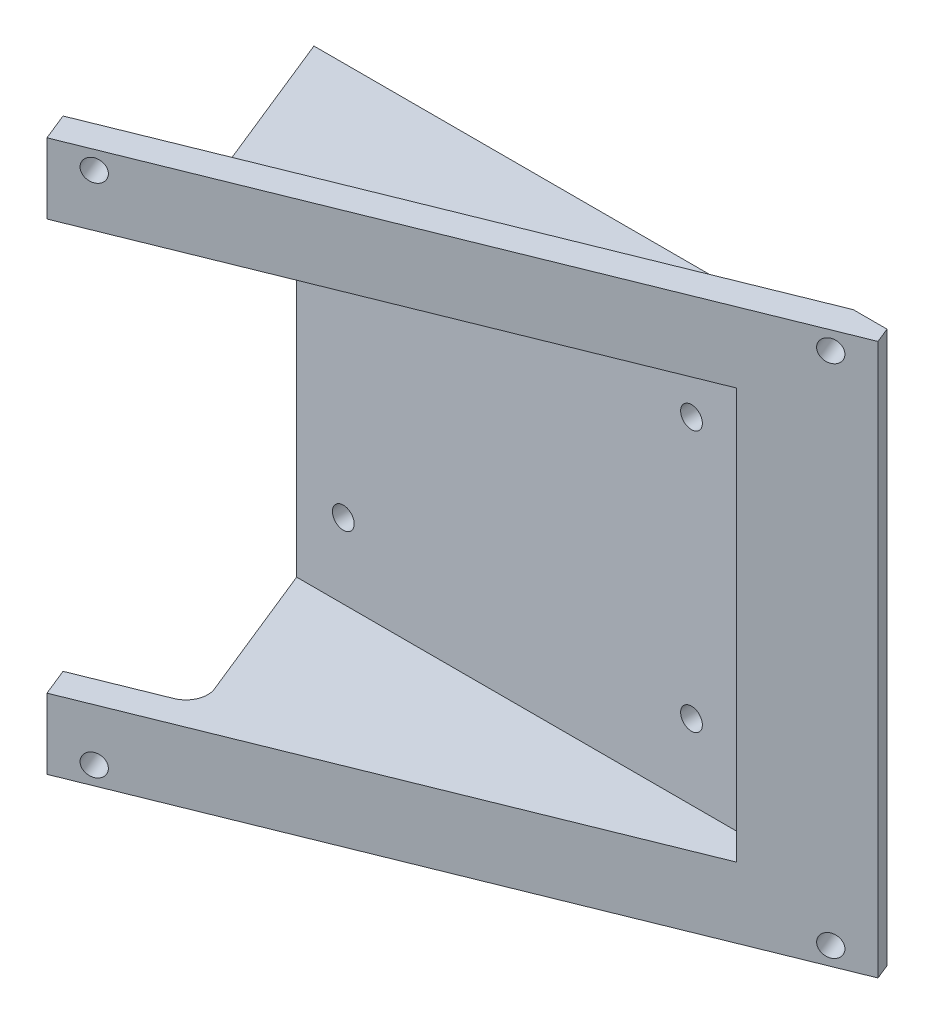
ISO-10303-21;
HEADER;
FILE_DESCRIPTION(('STEP AP214'),'2;1');
FILE_NAME('part.step','',(''),(''),'','','');
FILE_SCHEMA(('AUTOMOTIVE_DESIGN { 1 0 10303 214 1 1 1 1 }'));
ENDSEC;
DATA;
#1=APPLICATION_CONTEXT('core data for automotive mechanical design processes');
#2=APPLICATION_PROTOCOL_DEFINITION('international standard','automotive_design',2000,#1);
#3=PRODUCT_CONTEXT('',#1,'mechanical');
#4=PRODUCT('Part','Part','',(#3));
#5=PRODUCT_RELATED_PRODUCT_CATEGORY('part','',(#4));
#6=PRODUCT_DEFINITION_FORMATION('','',#4);
#7=PRODUCT_DEFINITION_CONTEXT('part definition',#1,'design');
#8=PRODUCT_DEFINITION('design','',#6,#7);
#9=PRODUCT_DEFINITION_SHAPE('','',#8);
#10=(LENGTH_UNIT() NAMED_UNIT(*) SI_UNIT(.MILLI.,.METRE.));
#11=(NAMED_UNIT(*) PLANE_ANGLE_UNIT() SI_UNIT($,.RADIAN.));
#12=(NAMED_UNIT(*) SI_UNIT($,.STERADIAN.) SOLID_ANGLE_UNIT());
#13=UNCERTAINTY_MEASURE_WITH_UNIT(LENGTH_MEASURE(1.E-05),#10,'distance_accuracy_value','');
#14=(GEOMETRIC_REPRESENTATION_CONTEXT(3) GLOBAL_UNCERTAINTY_ASSIGNED_CONTEXT((#13)) GLOBAL_UNIT_ASSIGNED_CONTEXT((#10,
#11,#12)) REPRESENTATION_CONTEXT('',''));
#15=CARTESIAN_POINT('',(0.,0.,0.));
#16=DIRECTION('',(0.,0.,1.));
#17=DIRECTION('',(1.,0.,0.));
#18=AXIS2_PLACEMENT_3D('',#15,#16,#17);
#19=CARTESIAN_POINT('',(5.93580542984478,0.,14.6903458779292));
#20=DIRECTION('',(0.374634830423855,0.,0.927172445574872));
#21=DIRECTION('',(0.927172445574872,0.,-0.374634830423855));
#22=AXIS2_PLACEMENT_3D('',#19,#20,#21);
#23=PLANE('',#22);
#24=CARTESIAN_POINT('',(-30.6567409661375,-35.51699308692,29.4759906404157));
#25=DIRECTION('',(-0.374634830423855,0.,-0.927172445574872));
#26=DIRECTION('',(-0.927172445574872,0.,0.374634830423855));
#27=AXIS2_PLACEMENT_3D('',#24,#25,#26);
#28=CIRCLE('',#27,1.50000000000001);
#29=CARTESIAN_POINT('',(-32.0474996344998,-35.51699308692,30.0379428860515));
#30=VERTEX_POINT('',#29);
#31=EDGE_CURVE('E194',#30,#30,#28,.T.);
#32=ORIENTED_EDGE('',*,*,#31,.F.);
#33=EDGE_LOOP('',(#32));
#34=FACE_BOUND('',#33,.T.);
#35=CARTESIAN_POINT('',(-30.6567409661375,35.48300691308,29.4759906404157));
#36=DIRECTION('',(-0.374634830423855,0.,-0.927172445574872));
#37=DIRECTION('',(-0.927172445574872,0.,0.374634830423855));
#38=AXIS2_PLACEMENT_3D('',#35,#36,#37);
#39=CIRCLE('',#38,1.5);
#40=CARTESIAN_POINT('',(-32.0474996344998,35.48300691308,30.0379428860515));
#41=VERTEX_POINT('',#40);
#42=EDGE_CURVE('E189',#41,#41,#39,.T.);
#43=ORIENTED_EDGE('',*,*,#42,.F.);
#44=EDGE_LOOP('',(#43));
#45=FACE_BOUND('',#44,.T.);
#46=DIRECTION('',(0.,1.,0.));
#47=VECTOR('',#46,1.);
#48=CARTESIAN_POINT('',(42.2924994899524,0.,0.));
#49=LINE('',#48,#47);
#50=CARTESIAN_POINT('',(42.2924994899524,-38.01699308692,0.));
#51=VERTEX_POINT('',#50);
#52=CARTESIAN_POINT('',(42.2924994899524,-36.854381580602,0.));
#53=VERTEX_POINT('',#52);
#54=EDGE_CURVE('E47',#51,#53,#49,.T.);
#55=ORIENTED_EDGE('',*,*,#54,.F.);
#56=DIRECTION('',(0.927172445574872,0.,-0.374634830423855));
#57=VECTOR('',#56,1.);
#58=CARTESIAN_POINT('',(-35.2926031940118,-38.01699308692,31.3491647925349));
#59=LINE('',#58,#57);
#60=CARTESIAN_POINT('',(-35.2926031940118,-38.01699308692,31.3491647925349));
#61=VERTEX_POINT('',#60);
#62=EDGE_CURVE('E252',#61,#51,#59,.T.);
#63=ORIENTED_EDGE('',*,*,#62,.F.);
#64=DIRECTION('',(0.,-1.,0.));
#65=VECTOR('',#64,1.);
#66=CARTESIAN_POINT('',(-35.2926031940118,37.98300691308,31.3491647925349));
#67=LINE('',#66,#65);
#68=CARTESIAN_POINT('',(-35.2926031940118,-28.319785640601,31.349164792535));
#69=VERTEX_POINT('',#68);
#70=EDGE_CURVE('E237',#69,#61,#67,.T.);
#71=ORIENTED_EDGE('',*,*,#70,.F.);
#72=DIRECTION('',(-0.927172445574872,0.,0.374634830423855));
#73=VECTOR('',#72,1.);
#74=CARTESIAN_POINT('',(5.93580542984478,-28.319785640601,14.6903458779292));
#75=LINE('',#74,#73);
#76=CARTESIAN_POINT('',(-24.399681259183,-28.319785640601,26.9477527560236));
#77=VERTEX_POINT('',#76);
#78=EDGE_CURVE('E268',#77,#69,#75,.T.);
#79=ORIENTED_EDGE('',*,*,#78,.F.);
#80=DIRECTION('',(0.,1.,0.));
#81=VECTOR('',#80,1.);
#82=CARTESIAN_POINT('',(-24.399681259183,-32.41699308692,26.9477527560236));
#83=LINE('',#82,#81);
#84=CARTESIAN_POINT('',(-24.399681259183,-35.319785640601,26.9477527560236));
#85=VERTEX_POINT('',#84);
#86=EDGE_CURVE('E594',#77,#85,#83,.F.);
#87=ORIENTED_EDGE('',*,*,#86,.T.);
#88=DIRECTION('',(-0.927172445574872,0.,0.374634830423855));
#89=VECTOR('',#88,1.);
#90=CARTESIAN_POINT('',(32.39302010064,-35.319785640601,4.));
#91=LINE('',#90,#89);
#92=CARTESIAN_POINT('',(36.5639418050511,-35.319785640601,2.31469048406159));
#93=VERTEX_POINT('',#92);
#94=EDGE_CURVE('E574',#85,#93,#91,.F.);
#95=ORIENTED_EDGE('',*,*,#94,.T.);
#96=DIRECTION('',(0.,-1.,0.));
#97=VECTOR('',#96,1.);
#98=CARTESIAN_POINT('',(36.5639418050511,0.,2.31469048406159));
#99=LINE('',#98,#97);
#100=CARTESIAN_POINT('',(36.5639418050511,35.280214359399,2.31469048406159));
#101=VERTEX_POINT('',#100);
#102=EDGE_CURVE('E361',#93,#101,#99,.F.);
#103=ORIENTED_EDGE('',*,*,#102,.T.);
#104=DIRECTION('',(0.927172445574872,0.,-0.374634830423855));
#105=VECTOR('',#104,1.);
#106=CARTESIAN_POINT('',(5.93580542984478,35.280214359399,14.6903458779292));
#107=LINE('',#106,#105);
#108=CARTESIAN_POINT('',(33.5169245919116,35.280214359399,3.54587329411082));
#109=VERTEX_POINT('',#108);
#110=EDGE_CURVE('E368',#101,#109,#107,.F.);
#111=ORIENTED_EDGE('',*,*,#110,.T.);
#112=DIRECTION('',(0.927172445574872,0.,-0.374634830423855));
#113=VECTOR('',#112,1.);
#114=CARTESIAN_POINT('',(32.39302010064,35.28300691308,4.));
#115=LINE('',#114,#113);
#116=CARTESIAN_POINT('',(-24.399681259183,35.28300691308,26.9477527560236));
#117=VERTEX_POINT('',#116);
#118=EDGE_CURVE('E55',#109,#117,#115,.F.);
#119=ORIENTED_EDGE('',*,*,#118,.T.);
#120=DIRECTION('',(0.,1.,0.));
#121=VECTOR('',#120,1.);
#122=CARTESIAN_POINT('',(-24.399681259183,-32.41699308692,26.9477527560236));
#123=LINE('',#122,#121);
#124=CARTESIAN_POINT('',(-24.3996812591829,28.28300691308,26.9477527560236));
#125=VERTEX_POINT('',#124);
#126=EDGE_CURVE('E582',#117,#125,#123,.F.);
#127=ORIENTED_EDGE('',*,*,#126,.T.);
#128=DIRECTION('',(-0.927172445574872,0.,0.374634830423855));
#129=VECTOR('',#128,1.);
#130=CARTESIAN_POINT('',(32.39302010064,28.28300691308,4.));
#131=LINE('',#130,#129);
#132=CARTESIAN_POINT('',(-35.2926031940118,28.28300691308,31.3491647925349));
#133=VERTEX_POINT('',#132);
#134=EDGE_CURVE('E222',#125,#133,#131,.T.);
#135=ORIENTED_EDGE('',*,*,#134,.T.);
#136=CARTESIAN_POINT('',(-35.2926031940118,37.98300691308,31.3491647925349));
#137=VERTEX_POINT('',#136);
#138=EDGE_CURVE('E249',#137,#133,#67,.T.);
#139=ORIENTED_EDGE('',*,*,#138,.F.);
#140=DIRECTION('',(-0.927172445574872,0.,0.374634830423855));
#141=VECTOR('',#140,1.);
#142=CARTESIAN_POINT('',(-35.2926031940118,37.98300691308,31.3491647925349));
#143=LINE('',#142,#141);
#144=CARTESIAN_POINT('',(42.2924994899524,37.98300691308,0.));
#145=VERTEX_POINT('',#144);
#146=EDGE_CURVE('E255',#145,#137,#143,.T.);
#147=ORIENTED_EDGE('',*,*,#146,.F.);
#148=CARTESIAN_POINT('',(42.2924994899524,36.820395406762,0.));
#149=VERTEX_POINT('',#148);
#150=EDGE_CURVE('E187',#149,#145,#49,.T.);
#151=ORIENTED_EDGE('',*,*,#150,.F.);
#152=CARTESIAN_POINT('',(41.6627097887025,35.48300691308,0.254473867354988));
#153=DIRECTION('',(-0.374634830423855,0.,-0.927172445574872));
#154=DIRECTION('',(-0.927172445574872,0.,0.374634830423855));
#155=AXIS2_PLACEMENT_3D('',#152,#153,#154);
#156=CIRCLE('',#155,1.5);
#157=CARTESIAN_POINT('',(42.2924994899524,34.145618419398,0.));
#158=VERTEX_POINT('',#157);
#159=EDGE_CURVE('E185',#158,#149,#156,.T.);
#160=ORIENTED_EDGE('',*,*,#159,.F.);
#161=CARTESIAN_POINT('',(42.2924994899524,-34.179604593238,0.));
#162=VERTEX_POINT('',#161);
#163=EDGE_CURVE('E176',#162,#158,#49,.T.);
#164=ORIENTED_EDGE('',*,*,#163,.F.);
#165=CARTESIAN_POINT('',(41.6627097887025,-35.51699308692,0.254473867354988));
#166=DIRECTION('',(-0.374634830423855,0.,-0.927172445574872));
#167=DIRECTION('',(-0.927172445574872,0.,0.374634830423855));
#168=AXIS2_PLACEMENT_3D('',#165,#166,#167);
#169=CIRCLE('',#168,1.49999999999999);
#170=EDGE_CURVE('E182',#53,#162,#169,.T.);
#171=ORIENTED_EDGE('',*,*,#170,.F.);
#172=EDGE_LOOP('',(#55,#63,#71,#79,#87,#95,#103,#111,#119,#127,#135,#139,#147,#151,#160,#164,#171));
#173=FACE_BOUND('',#172,.T.);
#174=ADVANCED_FACE('F33',(#34,#45,#173),#23,.F.);
#175=CARTESIAN_POINT('',(-33.7940638723164,-38.01699308692,35.0578545748344));
#176=DIRECTION('',(0.,1.,0.));
#177=DIRECTION('',(0.,0.,1.));
#178=AXIS2_PLACEMENT_3D('',#175,#176,#177);
#179=PLANE('',#178);
#180=DIRECTION('',(-1.,0.,0.));
#181=VECTOR('',#180,1.);
#182=CARTESIAN_POINT('',(-33.7940638723164,-38.01699308692,0.));
#183=LINE('',#182,#181);
#184=CARTESIAN_POINT('',(46.952626728388,-38.01699308692,0.));
#185=VERTEX_POINT('',#184);
#186=EDGE_CURVE('E458',#185,#51,#183,.T.);
#187=ORIENTED_EDGE('',*,*,#186,.F.);
#188=DIRECTION('',(-0.374634830423855,0.,-0.927172445574872));
#189=VECTOR('',#188,1.);
#190=CARTESIAN_POINT('',(47.7971113382723,-38.01699308692,2.08998949753521));
#191=LINE('',#190,#189);
#192=CARTESIAN_POINT('',(47.7971113382723,-38.01699308692,2.08998949753521));
#193=VERTEX_POINT('',#192);
#194=EDGE_CURVE('E262',#193,#185,#191,.T.);
#195=ORIENTED_EDGE('',*,*,#194,.F.);
#196=DIRECTION('',(0.927172445574872,0.,-0.374634830423855));
#197=VECTOR('',#196,1.);
#198=CARTESIAN_POINT('',(-33.7940638723164,-38.01699308692,35.0578545748344));
#199=LINE('',#198,#197);
#200=CARTESIAN_POINT('',(-33.7940638723164,-38.01699308692,35.0578545748344));
#201=VERTEX_POINT('',#200);
#202=EDGE_CURVE('E241',#201,#193,#199,.T.);
#203=ORIENTED_EDGE('',*,*,#202,.F.);
#204=DIRECTION('',(-0.374634830423855,0.,-0.927172445574872));
#205=VECTOR('',#204,1.);
#206=CARTESIAN_POINT('',(-33.7940638723164,-38.01699308692,35.0578545748344));
#207=LINE('',#206,#205);
#208=EDGE_CURVE('E265',#201,#61,#207,.T.);
#209=ORIENTED_EDGE('',*,*,#208,.T.);
#210=ORIENTED_EDGE('',*,*,#62,.T.);
#211=EDGE_LOOP('',(#187,#195,#203,#209,#210));
#212=FACE_BOUND('',#211,.T.);
#213=ADVANCED_FACE('F417',(#212),#179,.F.);
#214=CARTESIAN_POINT('',(47.7971113382723,37.98300691308,2.08998949753521));
#215=DIRECTION('',(-0.927172445574872,0.,0.374634830423855));
#216=DIRECTION('',(0.374634830423855,0.,0.927172445574872));
#217=AXIS2_PLACEMENT_3D('',#214,#215,#216);
#218=PLANE('',#217);
#219=DIRECTION('',(0.,-1.,0.));
#220=VECTOR('',#219,1.);
#221=CARTESIAN_POINT('',(46.9526267283881,37.98300691308,0.));
#222=LINE('',#221,#220);
#223=CARTESIAN_POINT('',(46.952626728388,37.98300691308,0.));
#224=VERTEX_POINT('',#223);
#225=EDGE_CURVE('E442',#224,#185,#222,.T.);
#226=ORIENTED_EDGE('',*,*,#225,.F.);
#227=DIRECTION('',(-0.374634830423855,0.,-0.927172445574872));
#228=VECTOR('',#227,1.);
#229=CARTESIAN_POINT('',(47.7971113382723,37.98300691308,2.08998949753521));
#230=LINE('',#229,#228);
#231=CARTESIAN_POINT('',(47.7971113382723,37.98300691308,2.08998949753521));
#232=VERTEX_POINT('',#231);
#233=EDGE_CURVE('E259',#232,#224,#230,.T.);
#234=ORIENTED_EDGE('',*,*,#233,.F.);
#235=DIRECTION('',(0.,1.,0.));
#236=VECTOR('',#235,1.);
#237=CARTESIAN_POINT('',(47.7971113382723,37.98300691308,2.08998949753521));
#238=LINE('',#237,#236);
#239=EDGE_CURVE('E244',#193,#232,#238,.T.);
#240=ORIENTED_EDGE('',*,*,#239,.F.);
#241=ORIENTED_EDGE('',*,*,#194,.T.);
#242=EDGE_LOOP('',(#226,#234,#240,#241));
#243=FACE_BOUND('',#242,.T.);
#244=ADVANCED_FACE('F423',(#243),#218,.F.);
#245=CARTESIAN_POINT('',(-33.7940638723164,37.98300691308,35.0578545748344));
#246=DIRECTION('',(0.,-1.,0.));
#247=DIRECTION('',(0.,0.,-1.));
#248=AXIS2_PLACEMENT_3D('',#245,#246,#247);
#249=PLANE('',#248);
#250=DIRECTION('',(1.,0.,0.));
#251=VECTOR('',#250,1.);
#252=CARTESIAN_POINT('',(-33.7940638723164,37.98300691308,0.));
#253=LINE('',#252,#251);
#254=EDGE_CURVE('E447',#145,#224,#253,.T.);
#255=ORIENTED_EDGE('',*,*,#254,.F.);
#256=ORIENTED_EDGE('',*,*,#146,.T.);
#257=DIRECTION('',(-0.374634830423855,0.,-0.927172445574872));
#258=VECTOR('',#257,1.);
#259=CARTESIAN_POINT('',(-33.7940638723164,37.98300691308,35.0578545748344));
#260=LINE('',#259,#258);
#261=CARTESIAN_POINT('',(-33.7940638723164,37.98300691308,35.0578545748344));
#262=VERTEX_POINT('',#261);
#263=EDGE_CURVE('E248',#262,#137,#260,.T.);
#264=ORIENTED_EDGE('',*,*,#263,.F.);
#265=DIRECTION('',(-0.927172445574872,0.,0.374634830423855));
#266=VECTOR('',#265,1.);
#267=CARTESIAN_POINT('',(-33.7940638723164,37.98300691308,35.0578545748344));
#268=LINE('',#267,#266);
#269=EDGE_CURVE('E246',#232,#262,#268,.T.);
#270=ORIENTED_EDGE('',*,*,#269,.F.);
#271=ORIENTED_EDGE('',*,*,#233,.T.);
#272=EDGE_LOOP('',(#255,#256,#264,#270,#271));
#273=FACE_BOUND('',#272,.T.);
#274=ADVANCED_FACE('F431',(#273),#249,.F.);
#275=CARTESIAN_POINT('',(65.901583317126,35.48300691308,60.2425310960492));
#276=DIRECTION('',(-0.374634830423855,0.,-0.927172445574872));
#277=DIRECTION('',(-0.927172445574872,0.,0.374634830423855));
#278=AXIS2_PLACEMENT_3D('',#275,#276,#277);
#279=CYLINDRICAL_SURFACE('',#278,1.5);
#280=CARTESIAN_POINT('',(43.161249110398,35.48300691308,3.96316364965449));
#281=DIRECTION('',(0.374634830423855,0.,0.927172445574872));
#282=DIRECTION('',(0.927172445574872,0.,-0.374634830423855));
#283=AXIS2_PLACEMENT_3D('',#280,#281,#282);
#284=CIRCLE('',#283,1.5);
#285=CARTESIAN_POINT('',(44.5520077787603,35.48300691308,3.40121140401871));
#286=VERTEX_POINT('',#285);
#287=EDGE_CURVE('E191',#286,#286,#284,.T.);
#288=ORIENTED_EDGE('',*,*,#287,.T.);
#289=EDGE_LOOP('',(#288));
#290=FACE_BOUND('',#289,.T.);
#291=CARTESIAN_POINT('',(41.5598866573651,35.48300691308,0.));
#292=DIRECTION('',(0.,0.,-1.));
#293=DIRECTION('',(-1.,0.,0.));
#294=AXIS2_PLACEMENT_3D('',#291,#292,#293);
#295=ELLIPSE('',#294,1.6178220213069,1.5);
#296=EDGE_CURVE('E460',#158,#149,#295,.F.);
#297=ORIENTED_EDGE('',*,*,#296,.F.);
#298=ORIENTED_EDGE('',*,*,#159,.T.);
#299=EDGE_LOOP('',(#297,#298));
#300=FACE_BOUND('',#299,.T.);
#301=ADVANCED_FACE('F434',(#290,#300),#279,.F.);
#302=CARTESIAN_POINT('',(65.901583317126,-35.51699308692,60.2425310960492));
#303=DIRECTION('',(-0.374634830423855,0.,-0.927172445574872));
#304=DIRECTION('',(-0.927172445574872,0.,0.374634830423855));
#305=AXIS2_PLACEMENT_3D('',#302,#303,#304);
#306=CYLINDRICAL_SURFACE('',#305,1.49999999999999);
#307=CARTESIAN_POINT('',(43.161249110398,-35.51699308692,3.96316364965449));
#308=DIRECTION('',(0.374634830423855,0.,0.927172445574872));
#309=DIRECTION('',(0.927172445574872,0.,-0.374634830423855));
#310=AXIS2_PLACEMENT_3D('',#307,#308,#309);
#311=CIRCLE('',#310,1.49999999999999);
#312=CARTESIAN_POINT('',(44.5520077787603,-35.51699308692,3.40121140401871));
#313=VERTEX_POINT('',#312);
#314=EDGE_CURVE('E207',#313,#313,#311,.T.);
#315=ORIENTED_EDGE('',*,*,#314,.T.);
#316=EDGE_LOOP('',(#315));
#317=FACE_BOUND('',#316,.T.);
#318=CARTESIAN_POINT('',(41.5598866573651,-35.51699308692,0.));
#319=DIRECTION('',(0.,0.,-1.));
#320=DIRECTION('',(-1.,0.,0.));
#321=AXIS2_PLACEMENT_3D('',#318,#319,#320);
#322=ELLIPSE('',#321,1.61782202130689,1.49999999999999);
#323=EDGE_CURVE('E11',#53,#162,#322,.F.);
#324=ORIENTED_EDGE('',*,*,#323,.F.);
#325=ORIENTED_EDGE('',*,*,#170,.T.);
#326=EDGE_LOOP('',(#324,#325));
#327=FACE_BOUND('',#326,.T.);
#328=ADVANCED_FACE('F188',(#317,#327),#306,.F.);
#329=CARTESIAN_POINT('',(-25.5235857504545,-32.41699308692,24.166235419299));
#330=DIRECTION('',(0.,-1.,0.));
#331=DIRECTION('',(0.,0.,-1.));
#332=AXIS2_PLACEMENT_3D('',#329,#330,#331);
#333=CYLINDRICAL_SURFACE('',#332,3.);
#334=DIRECTION('',(0.,1.,0.));
#335=VECTOR('',#334,1.);
#336=CARTESIAN_POINT('',(-22.7420684137299,-32.41699308692,23.0423309280274));
#337=LINE('',#336,#335);
#338=CARTESIAN_POINT('',(-22.7420684137299,28.28300691308,23.0423309280274));
#339=VERTEX_POINT('',#338);
#340=CARTESIAN_POINT('',(-22.7420684137299,32.28300691308,23.0423309280274));
#341=VERTEX_POINT('',#340);
#342=EDGE_CURVE('E584',#339,#341,#337,.T.);
#343=ORIENTED_EDGE('',*,*,#342,.F.);
#344=CARTESIAN_POINT('',(-25.5235857504545,28.28300691308,24.166235419299));
#345=DIRECTION('',(0.,1.,0.));
#346=DIRECTION('',(0.,0.,1.));
#347=AXIS2_PLACEMENT_3D('',#344,#345,#346);
#348=CIRCLE('',#347,3.);
#349=EDGE_CURVE('E581',#339,#125,#348,.F.);
#350=ORIENTED_EDGE('',*,*,#349,.T.);
#351=ORIENTED_EDGE('',*,*,#126,.F.);
#352=CARTESIAN_POINT('',(-25.5235857504545,35.28300691308,24.166235419299));
#353=DIRECTION('',(-0.655609923595307,-0.707106781186547,0.26490682906138));
#354=DIRECTION('',(-0.655609923595307,0.707106781186547,0.26490682906138));
#355=AXIS2_PLACEMENT_3D('',#352,#353,#354);
#356=ELLIPSE('',#355,4.24264068711928,3.);
#357=EDGE_CURVE('E41',#117,#341,#356,.F.);
#358=ORIENTED_EDGE('',*,*,#357,.T.);
#359=EDGE_LOOP('',(#343,#350,#351,#358));
#360=FACE_BOUND('',#359,.T.);
#361=ADVANCED_FACE('F35',(#360),#333,.F.);
#362=CARTESIAN_POINT('',(-25.5235857504545,-32.41699308692,24.166235419299));
#363=DIRECTION('',(0.,-1.,0.));
#364=DIRECTION('',(0.,0.,-1.));
#365=AXIS2_PLACEMENT_3D('',#362,#363,#364);
#366=CYLINDRICAL_SURFACE('',#365,3.);
#367=DIRECTION('',(0.,1.,0.));
#368=VECTOR('',#367,1.);
#369=CARTESIAN_POINT('',(-22.7420684137299,-32.41699308692,23.0423309280274));
#370=LINE('',#369,#368);
#371=CARTESIAN_POINT('',(-22.7420684137299,-32.319785640601,23.0423309280274));
#372=VERTEX_POINT('',#371);
#373=CARTESIAN_POINT('',(-22.7420684137299,-28.319785640601,23.0423309280274));
#374=VERTEX_POINT('',#373);
#375=EDGE_CURVE('E596',#372,#374,#370,.T.);
#376=ORIENTED_EDGE('',*,*,#375,.F.);
#377=CARTESIAN_POINT('',(-25.5235857504545,-35.319785640601,24.166235419299));
#378=DIRECTION('',(0.655609923595307,-0.707106781186547,-0.26490682906138));
#379=DIRECTION('',(0.655609923595307,0.707106781186547,-0.26490682906138));
#380=AXIS2_PLACEMENT_3D('',#377,#378,#379);
#381=ELLIPSE('',#380,4.24264068711928,3.);
#382=EDGE_CURVE('E591',#372,#85,#381,.T.);
#383=ORIENTED_EDGE('',*,*,#382,.T.);
#384=ORIENTED_EDGE('',*,*,#86,.F.);
#385=CARTESIAN_POINT('',(-25.5235857504545,-28.319785640601,24.166235419299));
#386=DIRECTION('',(0.,-1.,0.));
#387=DIRECTION('',(0.,0.,-1.));
#388=AXIS2_PLACEMENT_3D('',#385,#386,#387);
#389=CIRCLE('',#388,3.);
#390=EDGE_CURVE('E587',#77,#374,#389,.F.);
#391=ORIENTED_EDGE('',*,*,#390,.T.);
#392=EDGE_LOOP('',(#376,#383,#384,#391));
#393=FACE_BOUND('',#392,.T.);
#394=ADVANCED_FACE('F407',(#393),#366,.F.);
#395=CARTESIAN_POINT('',(31.2691156093684,-35.319785640601,1.21848266327538));
#396=DIRECTION('',(0.927172445574872,0.,-0.374634830423855));
#397=DIRECTION('',(-0.374634830423855,0.,-0.927172445574872));
#398=AXIS2_PLACEMENT_3D('',#395,#396,#397);
#399=CYLINDRICAL_SURFACE('',#398,3.);
#400=DIRECTION('',(-0.927172445574872,0.,0.374634830423855));
#401=VECTOR('',#400,1.);
#402=CARTESIAN_POINT('',(31.2691156093684,-32.319785640601,1.21848266327538));
#403=LINE('',#402,#401);
#404=CARTESIAN_POINT('',(32.6585199770549,-32.319785640601,0.657077638608544));
#405=VERTEX_POINT('',#404);
#406=EDGE_CURVE('E384',#405,#372,#403,.T.);
#407=ORIENTED_EDGE('',*,*,#406,.F.);
#408=CARTESIAN_POINT('',(35.4400373137795,-35.319785640601,-0.466826852663024));
#409=DIRECTION('',(-0.655609923595307,-0.707106781186547,0.26490682906138));
#410=DIRECTION('',(0.655609923595307,-0.707106781186547,-0.26490682906138));
#411=AXIS2_PLACEMENT_3D('',#408,#409,#410);
#412=ELLIPSE('',#411,4.24264068711928,3.);
#413=EDGE_CURVE('E599',#405,#93,#412,.F.);
#414=ORIENTED_EDGE('',*,*,#413,.T.);
#415=ORIENTED_EDGE('',*,*,#94,.F.);
#416=ORIENTED_EDGE('',*,*,#382,.F.);
#417=EDGE_LOOP('',(#407,#414,#415,#416));
#418=FACE_BOUND('',#417,.T.);
#419=ADVANCED_FACE('F405',(#418),#399,.F.);
#420=CARTESIAN_POINT('',(31.2691156093684,35.28300691308,1.21848266327538));
#421=DIRECTION('',(-0.927172445574872,0.,0.374634830423855));
#422=DIRECTION('',(0.374634830423855,0.,0.927172445574872));
#423=AXIS2_PLACEMENT_3D('',#420,#421,#422);
#424=CYLINDRICAL_SURFACE('',#423,3.);
#425=CARTESIAN_POINT('',(32.39302010064,35.280214359399,0.764355957386201));
#426=DIRECTION('',(-0.927172445574872,0.,0.374634830423855));
#427=DIRECTION('',(0.,-1.,0.));
#428=AXIS2_PLACEMENT_3D('',#425,#426,#427);
#429=CIRCLE('',#428,3.);
#430=CARTESIAN_POINT('',(32.39302010064,32.2816106362395,0.764355957386206));
#431=VERTEX_POINT('',#430);
#432=EDGE_CURVE('E379',#431,#109,#429,.T.);
#433=ORIENTED_EDGE('',*,*,#432,.F.);
#434=DIRECTION('',(0.927172445574872,0.,-0.374634830423855));
#435=VECTOR('',#434,1.);
#436=CARTESIAN_POINT('',(31.2691156093684,32.28300691308,1.21848266327538));
#437=LINE('',#436,#435);
#438=EDGE_CURVE('E366',#341,#431,#437,.T.);
#439=ORIENTED_EDGE('',*,*,#438,.F.);
#440=ORIENTED_EDGE('',*,*,#357,.F.);
#441=ORIENTED_EDGE('',*,*,#118,.F.);
#442=EDGE_LOOP('',(#433,#439,#440,#441));
#443=FACE_BOUND('',#442,.T.);
#444=ADVANCED_FACE('F403',(#443),#424,.F.);
#445=CARTESIAN_POINT('',(4.81190093857322,35.280214359399,11.9088285412046));
#446=DIRECTION('',(-0.927172445574872,0.,0.374634830423855));
#447=DIRECTION('',(0.374634830423855,0.,0.927172445574872));
#448=AXIS2_PLACEMENT_3D('',#445,#446,#447);
#449=CYLINDRICAL_SURFACE('',#448,3.);
#450=DIRECTION('',(0.927172445574872,0.,-0.374634830423855));
#451=VECTOR('',#450,1.);
#452=CARTESIAN_POINT('',(4.81190093857322,32.280214359399,11.9088285412046));
#453=LINE('',#452,#451);
#454=CARTESIAN_POINT('',(32.6585199770549,32.280214359399,0.657077638608544));
#455=VERTEX_POINT('',#454);
#456=EDGE_CURVE('E375',#431,#455,#453,.T.);
#457=ORIENTED_EDGE('',*,*,#456,.F.);
#458=ORIENTED_EDGE('',*,*,#432,.T.);
#459=ORIENTED_EDGE('',*,*,#110,.F.);
#460=CARTESIAN_POINT('',(35.4400373137795,35.280214359399,-0.466826852663025));
#461=DIRECTION('',(0.655609923595307,-0.707106781186547,-0.26490682906138));
#462=DIRECTION('',(-0.655609923595307,-0.707106781186547,0.26490682906138));
#463=AXIS2_PLACEMENT_3D('',#460,#461,#462);
#464=ELLIPSE('',#463,4.24264068711928,3.);
#465=EDGE_CURVE('E382',#101,#455,#464,.T.);
#466=ORIENTED_EDGE('',*,*,#465,.T.);
#467=EDGE_LOOP('',(#457,#458,#459,#466));
#468=FACE_BOUND('',#467,.T.);
#469=ADVANCED_FACE('F394',(#468),#449,.F.);
#470=CARTESIAN_POINT('',(35.4400373137795,32.280214359399,-0.466826852663024));
#471=DIRECTION('',(0.,-1.,0.));
#472=DIRECTION('',(0.,0.,-1.));
#473=AXIS2_PLACEMENT_3D('',#470,#471,#472);
#474=CYLINDRICAL_SURFACE('',#473,3.);
#475=DIRECTION('',(0.,-1.,0.));
#476=VECTOR('',#475,1.);
#477=CARTESIAN_POINT('',(32.6585199770549,32.280214359399,0.657077638608543));
#478=LINE('',#477,#476);
#479=EDGE_CURVE('E513',#455,#405,#478,.T.);
#480=ORIENTED_EDGE('',*,*,#479,.F.);
#481=ORIENTED_EDGE('',*,*,#465,.F.);
#482=ORIENTED_EDGE('',*,*,#102,.F.);
#483=ORIENTED_EDGE('',*,*,#413,.F.);
#484=EDGE_LOOP('',(#480,#481,#482,#483));
#485=FACE_BOUND('',#484,.T.);
#486=ADVANCED_FACE('F326',(#485),#474,.F.);
#487=CARTESIAN_POINT('',(0.,0.,4.));
#488=DIRECTION('',(0.,0.,1.));
#489=DIRECTION('',(1.,0.,0.));
#490=AXIS2_PLACEMENT_3D('',#487,#488,#489);
#491=PLANE('',#490);
#492=DIRECTION('',(0.,1.,0.));
#493=VECTOR('',#492,1.);
#494=CARTESIAN_POINT('',(-30.4363441141615,0.,4.));
#495=LINE('',#494,#493);
#496=CARTESIAN_POINT('',(-30.4363441141615,-28.319785640601,4.));
#497=VERTEX_POINT('',#496);
#498=CARTESIAN_POINT('',(-30.4363441141615,28.28300691308,4.));
#499=VERTEX_POINT('',#498);
#500=EDGE_CURVE('E215',#497,#499,#495,.T.);
#501=ORIENTED_EDGE('',*,*,#500,.F.);
#502=DIRECTION('',(1.,0.,0.));
#503=VECTOR('',#502,1.);
#504=CARTESIAN_POINT('',(-32.0525907237836,-28.319785640601,4.));
#505=LINE('',#504,#503);
#506=CARTESIAN_POINT('',(32.39302010064,-28.319785640601,4.));
#507=VERTEX_POINT('',#506);
#508=EDGE_CURVE('E500',#497,#507,#505,.T.);
#509=ORIENTED_EDGE('',*,*,#508,.T.);
#510=DIRECTION('',(0.,1.,0.));
#511=VECTOR('',#510,1.);
#512=CARTESIAN_POINT('',(32.39302010064,-32.319785640601,4.));
#513=LINE('',#512,#511);
#514=CARTESIAN_POINT('',(32.39302010064,28.28300691308,4.));
#515=VERTEX_POINT('',#514);
#516=EDGE_CURVE('E492',#507,#515,#513,.T.);
#517=ORIENTED_EDGE('',*,*,#516,.T.);
#518=DIRECTION('',(-1.,0.,0.));
#519=VECTOR('',#518,1.);
#520=CARTESIAN_POINT('',(-32.0525907237836,28.28300691308,4.));
#521=LINE('',#520,#519);
#522=EDGE_CURVE('E512',#515,#499,#521,.T.);
#523=ORIENTED_EDGE('',*,*,#522,.T.);
#524=EDGE_LOOP('',(#501,#509,#517,#523));
#525=FACE_BOUND('',#524,.T.);
#526=CARTESIAN_POINT('',(24.,18.,4.));
#527=DIRECTION('',(0.,0.,1.));
#528=DIRECTION('',(1.,0.,0.));
#529=AXIS2_PLACEMENT_3D('',#526,#527,#528);
#530=CIRCLE('',#529,1.5);
#531=CARTESIAN_POINT('',(25.5,18.,4.));
#532=VERTEX_POINT('',#531);
#533=EDGE_CURVE('E544',#532,#532,#530,.T.);
#534=ORIENTED_EDGE('',*,*,#533,.F.);
#535=EDGE_LOOP('',(#534));
#536=FACE_BOUND('',#535,.T.);
#537=CARTESIAN_POINT('',(-24.,18.,4.));
#538=DIRECTION('',(0.,0.,1.));
#539=DIRECTION('',(1.,0.,0.));
#540=AXIS2_PLACEMENT_3D('',#537,#538,#539);
#541=CIRCLE('',#540,1.5);
#542=CARTESIAN_POINT('',(-22.5,18.,4.));
#543=VERTEX_POINT('',#542);
#544=EDGE_CURVE('E550',#543,#543,#541,.T.);
#545=ORIENTED_EDGE('',*,*,#544,.F.);
#546=EDGE_LOOP('',(#545));
#547=FACE_BOUND('',#546,.T.);
#548=CARTESIAN_POINT('',(-24.,-18.,4.));
#549=DIRECTION('',(0.,0.,1.));
#550=DIRECTION('',(1.,0.,0.));
#551=AXIS2_PLACEMENT_3D('',#548,#549,#550);
#552=CIRCLE('',#551,1.5);
#553=CARTESIAN_POINT('',(-22.5,-18.,4.));
#554=VERTEX_POINT('',#553);
#555=EDGE_CURVE('E539',#554,#554,#552,.T.);
#556=ORIENTED_EDGE('',*,*,#555,.F.);
#557=EDGE_LOOP('',(#556));
#558=FACE_BOUND('',#557,.T.);
#559=CARTESIAN_POINT('',(24.,-18.,4.));
#560=DIRECTION('',(0.,0.,1.));
#561=DIRECTION('',(1.,0.,0.));
#562=AXIS2_PLACEMENT_3D('',#559,#560,#561);
#563=CIRCLE('',#562,1.5);
#564=CARTESIAN_POINT('',(25.5,-18.,4.));
#565=VERTEX_POINT('',#564);
#566=EDGE_CURVE('E532',#565,#565,#563,.T.);
#567=ORIENTED_EDGE('',*,*,#566,.F.);
#568=EDGE_LOOP('',(#567));
#569=FACE_BOUND('',#568,.T.);
#570=ADVANCED_FACE('F322',(#525,#536,#547,#558,#569),#491,.T.);
#571=CARTESIAN_POINT('',(32.39302010064,32.28300691308,4.));
#572=DIRECTION('',(0.,-1.,0.));
#573=DIRECTION('',(0.,0.,-1.));
#574=AXIS2_PLACEMENT_3D('',#571,#572,#573);
#575=PLANE('',#574);
#576=DIRECTION('',(-0.374634830423855,0.,-0.927172445574872));
#577=VECTOR('',#576,1.);
#578=CARTESIAN_POINT('',(-32.0525907237836,32.28300691308,0.));
#579=LINE('',#578,#577);
#580=CARTESIAN_POINT('',(-32.0525907237836,32.28300691308,0.));
#581=VERTEX_POINT('',#580);
#582=EDGE_CURVE('E210',#341,#581,#579,.T.);
#583=ORIENTED_EDGE('',*,*,#582,.F.);
#584=ORIENTED_EDGE('',*,*,#438,.T.);
#585=CARTESIAN_POINT('',(32.39302010064,32.28300691308,0.764355957386206));
#586=DIRECTION('',(0.,0.,-1.));
#587=VECTOR('',#586,1.);
#588=LINE('',#585,#587);
#589=CARTESIAN_POINT('',(32.39302010064,32.2816106362395,0.));
#590=VERTEX_POINT('',#589);
#591=EDGE_CURVE('E359',#431,#590,#588,.T.);
#592=ORIENTED_EDGE('',*,*,#591,.T.);
#593=DIRECTION('',(-1.,0.,0.));
#594=VECTOR('',#593,1.);
#595=CARTESIAN_POINT('',(32.39302010064,32.28300691308,0.));
#596=LINE('',#595,#594);
#597=EDGE_CURVE('E347',#590,#581,#596,.T.);
#598=ORIENTED_EDGE('',*,*,#597,.T.);
#599=EDGE_LOOP('',(#583,#584,#592,#598));
#600=FACE_BOUND('',#599,.T.);
#601=ADVANCED_FACE('F325',(#600),#575,.F.);
#602=CARTESIAN_POINT('',(32.39302010064,-32.319785640601,4.));
#603=DIRECTION('',(0.,1.,0.));
#604=DIRECTION('',(0.,0.,1.));
#605=AXIS2_PLACEMENT_3D('',#602,#603,#604);
#606=PLANE('',#605);
#607=DIRECTION('',(0.374634830423856,0.,0.927172445574872));
#608=VECTOR('',#607,1.);
#609=CARTESIAN_POINT('',(32.39302010064,-32.319785640601,0.));
#610=LINE('',#609,#608);
#611=CARTESIAN_POINT('',(32.39302010064,-32.319785640601,0.));
#612=VERTEX_POINT('',#611);
#613=EDGE_CURVE('E270',#612,#405,#610,.T.);
#614=ORIENTED_EDGE('',*,*,#613,.T.);
#615=ORIENTED_EDGE('',*,*,#406,.T.);
#616=DIRECTION('',(-0.374634830423855,0.,-0.927172445574872));
#617=VECTOR('',#616,1.);
#618=CARTESIAN_POINT('',(-21.6181639224583,-32.319785640601,25.823848264752));
#619=LINE('',#618,#617);
#620=CARTESIAN_POINT('',(-32.0525907237836,-32.319785640601,0.));
#621=VERTEX_POINT('',#620);
#622=EDGE_CURVE('E220',#372,#621,#619,.T.);
#623=ORIENTED_EDGE('',*,*,#622,.T.);
#624=DIRECTION('',(1.,0.,0.));
#625=VECTOR('',#624,1.);
#626=CARTESIAN_POINT('',(32.39302010064,-32.319785640601,0.));
#627=LINE('',#626,#625);
#628=EDGE_CURVE('E345',#621,#612,#627,.T.);
#629=ORIENTED_EDGE('',*,*,#628,.T.);
#630=EDGE_LOOP('',(#614,#615,#623,#629));
#631=FACE_BOUND('',#630,.T.);
#632=ADVANCED_FACE('F330',(#631),#606,.F.);
#633=CARTESIAN_POINT('',(0.,0.,0.));
#634=DIRECTION('',(0.,0.,1.));
#635=DIRECTION('',(1.,0.,0.));
#636=AXIS2_PLACEMENT_3D('',#633,#634,#635);
#637=PLANE('',#636);
#638=CARTESIAN_POINT('',(24.,18.,0.));
#639=DIRECTION('',(0.,0.,1.));
#640=DIRECTION('',(1.,0.,0.));
#641=AXIS2_PLACEMENT_3D('',#638,#639,#640);
#642=CIRCLE('',#641,1.5);
#643=CARTESIAN_POINT('',(25.5,18.,0.));
#644=VERTEX_POINT('',#643);
#645=EDGE_CURVE('E541',#644,#644,#642,.T.);
#646=ORIENTED_EDGE('',*,*,#645,.T.);
#647=EDGE_LOOP('',(#646));
#648=FACE_BOUND('',#647,.T.);
#649=CARTESIAN_POINT('',(-24.,18.,0.));
#650=DIRECTION('',(0.,0.,1.));
#651=DIRECTION('',(1.,0.,0.));
#652=AXIS2_PLACEMENT_3D('',#649,#650,#651);
#653=CIRCLE('',#652,1.5);
#654=CARTESIAN_POINT('',(-22.5,18.,0.));
#655=VERTEX_POINT('',#654);
#656=EDGE_CURVE('E547',#655,#655,#653,.T.);
#657=ORIENTED_EDGE('',*,*,#656,.T.);
#658=EDGE_LOOP('',(#657));
#659=FACE_BOUND('',#658,.T.);
#660=CARTESIAN_POINT('',(-24.,-18.,0.));
#661=DIRECTION('',(0.,0.,1.));
#662=DIRECTION('',(1.,0.,0.));
#663=AXIS2_PLACEMENT_3D('',#660,#661,#662);
#664=CIRCLE('',#663,1.5);
#665=CARTESIAN_POINT('',(-22.5,-18.,0.));
#666=VERTEX_POINT('',#665);
#667=EDGE_CURVE('E553',#666,#666,#664,.T.);
#668=ORIENTED_EDGE('',*,*,#667,.T.);
#669=EDGE_LOOP('',(#668));
#670=FACE_BOUND('',#669,.T.);
#671=CARTESIAN_POINT('',(24.,-18.,0.));
#672=DIRECTION('',(0.,0.,1.));
#673=DIRECTION('',(1.,0.,0.));
#674=AXIS2_PLACEMENT_3D('',#671,#672,#673);
#675=CIRCLE('',#674,1.5);
#676=CARTESIAN_POINT('',(25.5,-18.,0.));
#677=VERTEX_POINT('',#676);
#678=EDGE_CURVE('E521',#677,#677,#675,.T.);
#679=ORIENTED_EDGE('',*,*,#678,.T.);
#680=EDGE_LOOP('',(#679));
#681=FACE_BOUND('',#680,.T.);
#682=DIRECTION('',(0.,1.,0.));
#683=VECTOR('',#682,1.);
#684=CARTESIAN_POINT('',(32.39302010064,-32.319785640601,0.));
#685=LINE('',#684,#683);
#686=EDGE_CURVE('E529',#612,#590,#685,.T.);
#687=ORIENTED_EDGE('',*,*,#686,.F.);
#688=ORIENTED_EDGE('',*,*,#628,.F.);
#689=DIRECTION('',(0.,-1.,0.));
#690=VECTOR('',#689,1.);
#691=CARTESIAN_POINT('',(-32.0525907237836,-32.319785640601,0.));
#692=LINE('',#691,#690);
#693=EDGE_CURVE('E523',#581,#621,#692,.T.);
#694=ORIENTED_EDGE('',*,*,#693,.F.);
#695=ORIENTED_EDGE('',*,*,#597,.F.);
#696=EDGE_LOOP('',(#687,#688,#694,#695));
#697=FACE_BOUND('',#696,.T.);
#698=ADVANCED_FACE('F320',(#648,#659,#670,#681,#697),#637,.F.);
#699=CARTESIAN_POINT('',(24.,-18.,4.));
#700=DIRECTION('',(0.,0.,-1.));
#701=DIRECTION('',(-1.,0.,0.));
#702=AXIS2_PLACEMENT_3D('',#699,#700,#701);
#703=CYLINDRICAL_SURFACE('',#702,1.5);
#704=ORIENTED_EDGE('',*,*,#566,.T.);
#705=EDGE_LOOP('',(#704));
#706=FACE_BOUND('',#705,.T.);
#707=ORIENTED_EDGE('',*,*,#678,.F.);
#708=EDGE_LOOP('',(#707));
#709=FACE_BOUND('',#708,.T.);
#710=ADVANCED_FACE('F310',(#706,#709),#703,.F.);
#711=CARTESIAN_POINT('',(-24.,-18.,4.));
#712=DIRECTION('',(0.,0.,-1.));
#713=DIRECTION('',(-1.,0.,0.));
#714=AXIS2_PLACEMENT_3D('',#711,#712,#713);
#715=CYLINDRICAL_SURFACE('',#714,1.5);
#716=ORIENTED_EDGE('',*,*,#555,.T.);
#717=EDGE_LOOP('',(#716));
#718=FACE_BOUND('',#717,.T.);
#719=ORIENTED_EDGE('',*,*,#667,.F.);
#720=EDGE_LOOP('',(#719));
#721=FACE_BOUND('',#720,.T.);
#722=ADVANCED_FACE('F306',(#718,#721),#715,.F.);
#723=CARTESIAN_POINT('',(-24.,18.,4.));
#724=DIRECTION('',(0.,0.,-1.));
#725=DIRECTION('',(-1.,0.,0.));
#726=AXIS2_PLACEMENT_3D('',#723,#724,#725);
#727=CYLINDRICAL_SURFACE('',#726,1.5);
#728=ORIENTED_EDGE('',*,*,#544,.T.);
#729=EDGE_LOOP('',(#728));
#730=FACE_BOUND('',#729,.T.);
#731=ORIENTED_EDGE('',*,*,#656,.F.);
#732=EDGE_LOOP('',(#731));
#733=FACE_BOUND('',#732,.T.);
#734=ADVANCED_FACE('F309',(#730,#733),#727,.F.);
#735=CARTESIAN_POINT('',(24.,18.,4.));
#736=DIRECTION('',(0.,0.,-1.));
#737=DIRECTION('',(-1.,0.,0.));
#738=AXIS2_PLACEMENT_3D('',#735,#736,#737);
#739=CYLINDRICAL_SURFACE('',#738,1.5);
#740=ORIENTED_EDGE('',*,*,#533,.T.);
#741=EDGE_LOOP('',(#740));
#742=FACE_BOUND('',#741,.T.);
#743=ORIENTED_EDGE('',*,*,#645,.F.);
#744=EDGE_LOOP('',(#743));
#745=FACE_BOUND('',#744,.T.);
#746=ADVANCED_FACE('F304',(#742,#745),#739,.F.);
#747=CARTESIAN_POINT('',(0.,28.28300691308,0.));
#748=DIRECTION('',(0.,1.,0.));
#749=DIRECTION('',(0.,0.,1.));
#750=AXIS2_PLACEMENT_3D('',#747,#748,#749);
#751=PLANE('',#750);
#752=ORIENTED_EDGE('',*,*,#349,.F.);
#753=DIRECTION('',(-0.374634830423855,0.,-0.927172445574872));
#754=VECTOR('',#753,1.);
#755=CARTESIAN_POINT('',(-27.5539693523031,28.28300691308,11.1335023868228));
#756=LINE('',#755,#754);
#757=EDGE_CURVE('E218',#339,#499,#756,.T.);
#758=ORIENTED_EDGE('',*,*,#757,.T.);
#759=ORIENTED_EDGE('',*,*,#522,.F.);
#760=DIRECTION('',(-0.374634830423855,0.,-0.927172445574872));
#761=VECTOR('',#760,1.);
#762=CARTESIAN_POINT('',(33.8915594223354,28.28300691308,7.70868978229949));
#763=LINE('',#762,#761);
#764=CARTESIAN_POINT('',(33.8915594223354,28.28300691308,7.70868978229949));
#765=VERTEX_POINT('',#764);
#766=EDGE_CURVE('E234',#765,#515,#763,.T.);
#767=ORIENTED_EDGE('',*,*,#766,.F.);
#768=DIRECTION('',(-0.927172445574872,0.,0.374634830423855));
#769=VECTOR('',#768,1.);
#770=CARTESIAN_POINT('',(33.8915594223354,28.28300691308,7.70868978229949));
#771=LINE('',#770,#769);
#772=CARTESIAN_POINT('',(-33.7940638723164,28.28300691308,35.0578545748344));
#773=VERTEX_POINT('',#772);
#774=EDGE_CURVE('E225',#765,#773,#771,.T.);
#775=ORIENTED_EDGE('',*,*,#774,.T.);
#776=DIRECTION('',(-0.374634830423855,0.,-0.927172445574872));
#777=VECTOR('',#776,1.);
#778=CARTESIAN_POINT('',(-33.7940638723164,28.28300691308,35.0578545748344));
#779=LINE('',#778,#777);
#780=EDGE_CURVE('E233',#773,#133,#779,.T.);
#781=ORIENTED_EDGE('',*,*,#780,.T.);
#782=ORIENTED_EDGE('',*,*,#134,.F.);
#783=EDGE_LOOP('',(#752,#758,#759,#767,#775,#781,#782));
#784=FACE_BOUND('',#783,.T.);
#785=ADVANCED_FACE('F300',(#784),#751,.F.);
#786=CARTESIAN_POINT('',(0.,-28.319785640601,0.));
#787=DIRECTION('',(0.,-1.,0.));
#788=DIRECTION('',(0.,0.,-1.));
#789=AXIS2_PLACEMENT_3D('',#786,#787,#788);
#790=PLANE('',#789);
#791=ORIENTED_EDGE('',*,*,#390,.F.);
#792=ORIENTED_EDGE('',*,*,#78,.T.);
#793=DIRECTION('',(0.374634830423855,0.,0.927172445574872));
#794=VECTOR('',#793,1.);
#795=CARTESIAN_POINT('',(-33.7940638723164,-28.319785640601,35.0578545748344));
#796=LINE('',#795,#794);
#797=CARTESIAN_POINT('',(-33.7940638723164,-28.319785640601,35.0578545748344));
#798=VERTEX_POINT('',#797);
#799=EDGE_CURVE('E231',#69,#798,#796,.T.);
#800=ORIENTED_EDGE('',*,*,#799,.T.);
#801=DIRECTION('',(0.927172445574872,0.,-0.374634830423855));
#802=VECTOR('',#801,1.);
#803=CARTESIAN_POINT('',(33.8915594223354,-28.319785640601,7.70868978229949));
#804=LINE('',#803,#802);
#805=CARTESIAN_POINT('',(33.8915594223354,-28.319785640601,7.70868978229949));
#806=VERTEX_POINT('',#805);
#807=EDGE_CURVE('E227',#798,#806,#804,.T.);
#808=ORIENTED_EDGE('',*,*,#807,.T.);
#809=DIRECTION('',(-0.374634830423855,0.,-0.927172445574872));
#810=VECTOR('',#809,1.);
#811=CARTESIAN_POINT('',(33.8915594223354,-28.319785640601,7.70868978229949));
#812=LINE('',#811,#810);
#813=EDGE_CURVE('E229',#806,#507,#812,.T.);
#814=ORIENTED_EDGE('',*,*,#813,.T.);
#815=ORIENTED_EDGE('',*,*,#508,.F.);
#816=DIRECTION('',(0.374634830423855,0.,0.927172445574872));
#817=VECTOR('',#816,1.);
#818=CARTESIAN_POINT('',(-27.5539693523031,-28.319785640601,11.1335023868228));
#819=LINE('',#818,#817);
#820=EDGE_CURVE('E212',#497,#374,#819,.T.);
#821=ORIENTED_EDGE('',*,*,#820,.T.);
#822=EDGE_LOOP('',(#791,#792,#800,#808,#814,#815,#821));
#823=FACE_BOUND('',#822,.T.);
#824=ADVANCED_FACE('F296',(#823),#790,.F.);
#825=CARTESIAN_POINT('',(32.39302010064,32.280214359399,0.));
#826=DIRECTION('',(0.927172445574872,0.,-0.374634830423856));
#827=DIRECTION('',(-0.374634830423856,0.,-0.927172445574872));
#828=AXIS2_PLACEMENT_3D('',#825,#826,#827);
#829=PLANE('',#828);
#830=DIRECTION('',(0.374634830423856,0.,0.927172445574872));
#831=VECTOR('',#830,1.);
#832=CARTESIAN_POINT('',(32.39302010064,32.280214359399,0.));
#833=LINE('',#832,#831);
#834=EDGE_CURVE('E273',#590,#455,#833,.T.);
#835=ORIENTED_EDGE('',*,*,#834,.T.);
#836=ORIENTED_EDGE('',*,*,#479,.T.);
#837=ORIENTED_EDGE('',*,*,#613,.F.);
#838=ORIENTED_EDGE('',*,*,#686,.T.);
#839=EDGE_LOOP('',(#835,#836,#837,#838));
#840=FACE_BOUND('',#839,.T.);
#841=ADVANCED_FACE('F291',(#840),#829,.T.);
#842=CARTESIAN_POINT('',(0.,32.280214359399,0.));
#843=DIRECTION('',(0.,-1.,0.));
#844=DIRECTION('',(0.,0.,-1.));
#845=AXIS2_PLACEMENT_3D('',#842,#843,#844);
#846=PLANE('',#845);
#847=ORIENTED_EDGE('',*,*,#591,.F.);
#848=ORIENTED_EDGE('',*,*,#456,.T.);
#849=ORIENTED_EDGE('',*,*,#834,.F.);
#850=EDGE_LOOP('',(#847,#848,#849));
#851=FACE_BOUND('',#850,.T.);
#852=ADVANCED_FACE('F280',(#851),#846,.F.);
#853=CARTESIAN_POINT('',(-33.7940638723164,37.98300691308,35.0578545748344));
#854=DIRECTION('',(0.927172445574872,0.,-0.374634830423855));
#855=DIRECTION('',(-0.374634830423855,0.,-0.927172445574872));
#856=AXIS2_PLACEMENT_3D('',#853,#854,#855);
#857=PLANE('',#856);
#858=ORIENTED_EDGE('',*,*,#780,.F.);
#859=DIRECTION('',(0.,-1.,0.));
#860=VECTOR('',#859,1.);
#861=CARTESIAN_POINT('',(-33.7940638723164,37.98300691308,35.0578545748344));
#862=LINE('',#861,#860);
#863=EDGE_CURVE('E238',#262,#773,#862,.T.);
#864=ORIENTED_EDGE('',*,*,#863,.F.);
#865=ORIENTED_EDGE('',*,*,#263,.T.);
#866=ORIENTED_EDGE('',*,*,#138,.T.);
#867=EDGE_LOOP('',(#858,#864,#865,#866));
#868=FACE_BOUND('',#867,.T.);
#869=ADVANCED_FACE('F290',(#868),#857,.F.);
#870=ORIENTED_EDGE('',*,*,#799,.F.);
#871=ORIENTED_EDGE('',*,*,#70,.T.);
#872=ORIENTED_EDGE('',*,*,#208,.F.);
#873=EDGE_CURVE('E242',#798,#201,#862,.T.);
#874=ORIENTED_EDGE('',*,*,#873,.F.);
#875=EDGE_LOOP('',(#870,#871,#872,#874));
#876=FACE_BOUND('',#875,.T.);
#877=ADVANCED_FACE('F487',(#876),#857,.F.);
#878=CARTESIAN_POINT('',(7.4343447515402,0.,18.3990356602287));
#879=DIRECTION('',(0.374634830423855,0.,0.927172445574872));
#880=DIRECTION('',(0.927172445574872,0.,-0.374634830423855));
#881=AXIS2_PLACEMENT_3D('',#878,#879,#880);
#882=PLANE('',#881);
#883=ORIENTED_EDGE('',*,*,#314,.F.);
#884=EDGE_LOOP('',(#883));
#885=FACE_BOUND('',#884,.T.);
#886=CARTESIAN_POINT('',(-29.1582016444421,35.48300691308,33.1846804227152));
#887=DIRECTION('',(0.374634830423855,0.,0.927172445574872));
#888=DIRECTION('',(0.927172445574872,0.,-0.374634830423855));
#889=AXIS2_PLACEMENT_3D('',#886,#887,#888);
#890=CIRCLE('',#889,1.5);
#891=CARTESIAN_POINT('',(-27.7674429760798,35.48300691308,32.6227281770794));
#892=VERTEX_POINT('',#891);
#893=EDGE_CURVE('E204',#892,#892,#890,.T.);
#894=ORIENTED_EDGE('',*,*,#893,.F.);
#895=EDGE_LOOP('',(#894));
#896=FACE_BOUND('',#895,.T.);
#897=CARTESIAN_POINT('',(-29.1582016444421,-35.51699308692,33.1846804227152));
#898=DIRECTION('',(0.374634830423855,0.,0.927172445574872));
#899=DIRECTION('',(0.927172445574872,0.,-0.374634830423855));
#900=AXIS2_PLACEMENT_3D('',#897,#898,#899);
#901=CIRCLE('',#900,1.50000000000001);
#902=CARTESIAN_POINT('',(-27.7674429760797,-35.51699308692,32.6227281770794));
#903=VERTEX_POINT('',#902);
#904=EDGE_CURVE('E201',#903,#903,#901,.T.);
#905=ORIENTED_EDGE('',*,*,#904,.F.);
#906=EDGE_LOOP('',(#905));
#907=FACE_BOUND('',#906,.T.);
#908=ORIENTED_EDGE('',*,*,#287,.F.);
#909=EDGE_LOOP('',(#908));
#910=FACE_BOUND('',#909,.T.);
#911=ORIENTED_EDGE('',*,*,#863,.T.);
#912=ORIENTED_EDGE('',*,*,#774,.F.);
#913=DIRECTION('',(0.,1.,0.));
#914=VECTOR('',#913,1.);
#915=CARTESIAN_POINT('',(33.8915594223354,28.28300691308,7.70868978229949));
#916=LINE('',#915,#914);
#917=EDGE_CURVE('E223',#806,#765,#916,.T.);
#918=ORIENTED_EDGE('',*,*,#917,.F.);
#919=ORIENTED_EDGE('',*,*,#807,.F.);
#920=ORIENTED_EDGE('',*,*,#873,.T.);
#921=ORIENTED_EDGE('',*,*,#202,.T.);
#922=ORIENTED_EDGE('',*,*,#239,.T.);
#923=ORIENTED_EDGE('',*,*,#269,.T.);
#924=EDGE_LOOP('',(#911,#912,#918,#919,#920,#921,#922,#923));
#925=FACE_BOUND('',#924,.T.);
#926=ADVANCED_FACE('F429',(#885,#896,#907,#910,#925),#882,.T.);
#927=CARTESIAN_POINT('',(33.8915594223354,28.28300691308,7.70868978229949));
#928=DIRECTION('',(-0.927172445574872,0.,0.374634830423855));
#929=DIRECTION('',(0.374634830423855,0.,0.927172445574872));
#930=AXIS2_PLACEMENT_3D('',#927,#928,#929);
#931=PLANE('',#930);
#932=ORIENTED_EDGE('',*,*,#516,.F.);
#933=ORIENTED_EDGE('',*,*,#813,.F.);
#934=ORIENTED_EDGE('',*,*,#917,.T.);
#935=ORIENTED_EDGE('',*,*,#766,.T.);
#936=EDGE_LOOP('',(#932,#933,#934,#935));
#937=FACE_BOUND('',#936,.T.);
#938=ADVANCED_FACE('F480',(#937),#931,.T.);
#939=CARTESIAN_POINT('',(-32.0525907237836,-32.41699308692,0.));
#940=DIRECTION('',(0.927172445574872,0.,-0.374634830423855));
#941=DIRECTION('',(-0.374634830423855,0.,-0.927172445574872));
#942=AXIS2_PLACEMENT_3D('',#939,#940,#941);
#943=PLANE('',#942);
#944=ORIENTED_EDGE('',*,*,#757,.F.);
#945=ORIENTED_EDGE('',*,*,#342,.T.);
#946=ORIENTED_EDGE('',*,*,#582,.T.);
#947=ORIENTED_EDGE('',*,*,#693,.T.);
#948=ORIENTED_EDGE('',*,*,#622,.F.);
#949=ORIENTED_EDGE('',*,*,#375,.T.);
#950=ORIENTED_EDGE('',*,*,#820,.F.);
#951=ORIENTED_EDGE('',*,*,#500,.T.);
#952=EDGE_LOOP('',(#944,#945,#946,#947,#948,#949,#950,#951));
#953=FACE_BOUND('',#952,.T.);
#954=ADVANCED_FACE('F477',(#953),#943,.F.);
#955=CARTESIAN_POINT('',(-6.41786743771406,-35.51699308692,89.4640478691099));
#956=DIRECTION('',(-0.374634830423855,0.,-0.927172445574872));
#957=DIRECTION('',(-0.927172445574872,0.,0.374634830423855));
#958=AXIS2_PLACEMENT_3D('',#955,#956,#957);
#959=CYLINDRICAL_SURFACE('',#958,1.50000000000001);
#960=ORIENTED_EDGE('',*,*,#904,.T.);
#961=EDGE_LOOP('',(#960));
#962=FACE_BOUND('',#961,.T.);
#963=ORIENTED_EDGE('',*,*,#31,.T.);
#964=EDGE_LOOP('',(#963));
#965=FACE_BOUND('',#964,.T.);
#966=ADVANCED_FACE('F479',(#962,#965),#959,.F.);
#967=CARTESIAN_POINT('',(-6.41786743771406,35.48300691308,89.4640478691099));
#968=DIRECTION('',(-0.374634830423855,0.,-0.927172445574872));
#969=DIRECTION('',(-0.927172445574872,0.,0.374634830423855));
#970=AXIS2_PLACEMENT_3D('',#967,#968,#969);
#971=CYLINDRICAL_SURFACE('',#970,1.5);
#972=ORIENTED_EDGE('',*,*,#893,.T.);
#973=EDGE_LOOP('',(#972));
#974=FACE_BOUND('',#973,.T.);
#975=ORIENTED_EDGE('',*,*,#42,.T.);
#976=EDGE_LOOP('',(#975));
#977=FACE_BOUND('',#976,.T.);
#978=ADVANCED_FACE('F476',(#974,#977),#971,.F.);
#979=CARTESIAN_POINT('',(0.,0.,0.));
#980=DIRECTION('',(0.,0.,-1.));
#981=DIRECTION('',(-1.,0.,0.));
#982=AXIS2_PLACEMENT_3D('',#979,#980,#981);
#983=PLANE('',#982);
#984=ORIENTED_EDGE('',*,*,#225,.T.);
#985=ORIENTED_EDGE('',*,*,#186,.T.);
#986=ORIENTED_EDGE('',*,*,#54,.T.);
#987=ORIENTED_EDGE('',*,*,#323,.T.);
#988=ORIENTED_EDGE('',*,*,#163,.T.);
#989=ORIENTED_EDGE('',*,*,#296,.T.);
#990=ORIENTED_EDGE('',*,*,#150,.T.);
#991=ORIENTED_EDGE('',*,*,#254,.T.);
#992=EDGE_LOOP('',(#984,#985,#986,#987,#988,#989,#990,#991));
#993=FACE_BOUND('',#992,.T.);
#994=ADVANCED_FACE('F175',(#993),#983,.T.);
#995=CLOSED_SHELL('',(#174,#213,#244,#274,#301,#328,#361,#394,#419,#444,#469,#486,#570,#601,
#632,#698,#710,#722,#734,#746,#785,#824,#841,#852,#869,#877,#926,#938,#954,#966,#978,#994));
#996=MANIFOLD_SOLID_BREP('B2',#995);
#997=ADVANCED_BREP_SHAPE_REPRESENTATION('',(#18,#996),#14);
#998=SHAPE_DEFINITION_REPRESENTATION(#9,#997);
ENDSEC;
END-ISO-10303-21;
